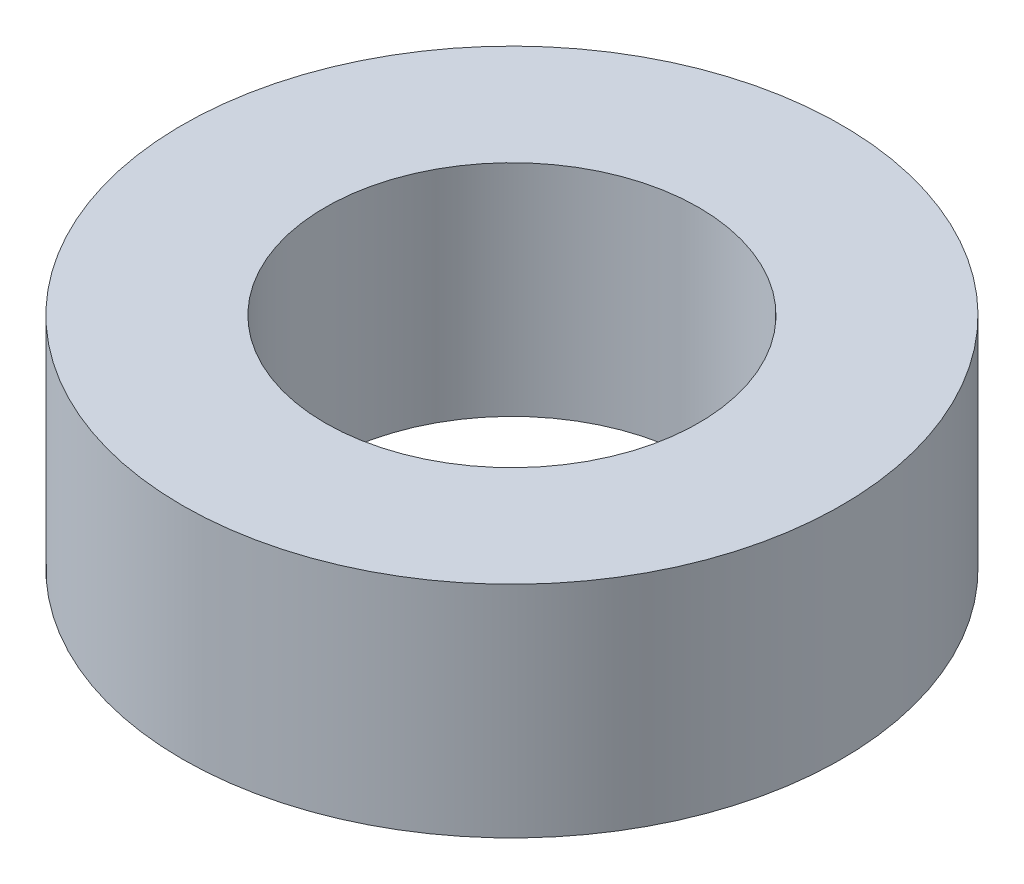
ISO-10303-21;
HEADER;
FILE_DESCRIPTION(('STEP AP214'),'2;1');
FILE_NAME('part.step','',(''),(''),'','','');
FILE_SCHEMA(('AUTOMOTIVE_DESIGN { 1 0 10303 214 1 1 1 1 }'));
ENDSEC;
DATA;
#1=APPLICATION_CONTEXT('core data for automotive mechanical design processes');
#2=APPLICATION_PROTOCOL_DEFINITION('international standard','automotive_design',2000,#1);
#3=PRODUCT_CONTEXT('',#1,'mechanical');
#4=PRODUCT('Part','Part','',(#3));
#5=PRODUCT_RELATED_PRODUCT_CATEGORY('part','',(#4));
#6=PRODUCT_DEFINITION_FORMATION('','',#4);
#7=PRODUCT_DEFINITION_CONTEXT('part definition',#1,'design');
#8=PRODUCT_DEFINITION('design','',#6,#7);
#9=PRODUCT_DEFINITION_SHAPE('','',#8);
#10=(LENGTH_UNIT() NAMED_UNIT(*) SI_UNIT(.MILLI.,.METRE.));
#11=(NAMED_UNIT(*) PLANE_ANGLE_UNIT() SI_UNIT($,.RADIAN.));
#12=(NAMED_UNIT(*) SI_UNIT($,.STERADIAN.) SOLID_ANGLE_UNIT());
#13=UNCERTAINTY_MEASURE_WITH_UNIT(LENGTH_MEASURE(1.E-05),#10,'distance_accuracy_value','');
#14=(GEOMETRIC_REPRESENTATION_CONTEXT(3) GLOBAL_UNCERTAINTY_ASSIGNED_CONTEXT((#13)) GLOBAL_UNIT_ASSIGNED_CONTEXT((#10,
#11,#12)) REPRESENTATION_CONTEXT('',''));
#15=CARTESIAN_POINT('',(0.,0.,0.));
#16=DIRECTION('',(0.,0.,1.));
#17=DIRECTION('',(1.,0.,0.));
#18=AXIS2_PLACEMENT_3D('',#15,#16,#17);
#19=CARTESIAN_POINT('',(0.,2.,0.));
#20=DIRECTION('',(0.,1.,0.));
#21=DIRECTION('',(0.,0.,1.));
#22=AXIS2_PLACEMENT_3D('',#19,#20,#21);
#23=PLANE('',#22);
#24=CARTESIAN_POINT('',(0.,2.,0.));
#25=DIRECTION('',(0.,1.,0.));
#26=DIRECTION('',(0.,0.,1.));
#27=AXIS2_PLACEMENT_3D('',#24,#25,#26);
#28=CIRCLE('',#27,3.);
#29=CARTESIAN_POINT('',(0.,2.,3.));
#30=VERTEX_POINT('',#29);
#31=EDGE_CURVE('E10',#30,#30,#28,.T.);
#32=ORIENTED_EDGE('',*,*,#31,.T.);
#33=EDGE_LOOP('',(#32));
#34=FACE_BOUND('',#33,.T.);
#35=CARTESIAN_POINT('',(0.,2.,0.));
#36=DIRECTION('',(0.,1.,0.));
#37=DIRECTION('',(0.,0.,1.));
#38=AXIS2_PLACEMENT_3D('',#35,#36,#37);
#39=CIRCLE('',#38,1.7);
#40=CARTESIAN_POINT('',(0.,2.,1.7));
#41=VERTEX_POINT('',#40);
#42=EDGE_CURVE('E43',#41,#41,#39,.T.);
#43=ORIENTED_EDGE('',*,*,#42,.F.);
#44=EDGE_LOOP('',(#43));
#45=FACE_BOUND('',#44,.T.);
#46=ADVANCED_FACE('F32',(#34,#45),#23,.T.);
#47=CARTESIAN_POINT('',(0.,0.,0.));
#48=DIRECTION('',(0.,1.,0.));
#49=DIRECTION('',(0.,0.,1.));
#50=AXIS2_PLACEMENT_3D('',#47,#48,#49);
#51=PLANE('',#50);
#52=CARTESIAN_POINT('',(0.,0.,0.));
#53=DIRECTION('',(0.,1.,0.));
#54=DIRECTION('',(0.,0.,1.));
#55=AXIS2_PLACEMENT_3D('',#52,#53,#54);
#56=CIRCLE('',#55,3.);
#57=CARTESIAN_POINT('',(0.,0.,3.));
#58=VERTEX_POINT('',#57);
#59=EDGE_CURVE('E36',#58,#58,#56,.T.);
#60=ORIENTED_EDGE('',*,*,#59,.F.);
#61=EDGE_LOOP('',(#60));
#62=FACE_BOUND('',#61,.T.);
#63=CARTESIAN_POINT('',(0.,0.,0.));
#64=DIRECTION('',(0.,1.,0.));
#65=DIRECTION('',(0.,0.,1.));
#66=AXIS2_PLACEMENT_3D('',#63,#64,#65);
#67=CIRCLE('',#66,1.7);
#68=CARTESIAN_POINT('',(0.,0.,1.7));
#69=VERTEX_POINT('',#68);
#70=EDGE_CURVE('E45',#69,#69,#67,.T.);
#71=ORIENTED_EDGE('',*,*,#70,.T.);
#72=EDGE_LOOP('',(#71));
#73=FACE_BOUND('',#72,.T.);
#74=ADVANCED_FACE('F55',(#62,#73),#51,.F.);
#75=CARTESIAN_POINT('',(0.,2.,0.));
#76=DIRECTION('',(0.,-1.,0.));
#77=DIRECTION('',(0.,0.,-1.));
#78=AXIS2_PLACEMENT_3D('',#75,#76,#77);
#79=CYLINDRICAL_SURFACE('',#78,3.);
#80=ORIENTED_EDGE('',*,*,#31,.F.);
#81=EDGE_LOOP('',(#80));
#82=FACE_BOUND('',#81,.T.);
#83=ORIENTED_EDGE('',*,*,#59,.T.);
#84=EDGE_LOOP('',(#83));
#85=FACE_BOUND('',#84,.T.);
#86=ADVANCED_FACE('F34',(#82,#85),#79,.T.);
#87=CARTESIAN_POINT('',(0.,2.,0.));
#88=DIRECTION('',(0.,-1.,0.));
#89=DIRECTION('',(0.,0.,-1.));
#90=AXIS2_PLACEMENT_3D('',#87,#88,#89);
#91=CYLINDRICAL_SURFACE('',#90,1.7);
#92=ORIENTED_EDGE('',*,*,#42,.T.);
#93=EDGE_LOOP('',(#92));
#94=FACE_BOUND('',#93,.T.);
#95=ORIENTED_EDGE('',*,*,#70,.F.);
#96=EDGE_LOOP('',(#95));
#97=FACE_BOUND('',#96,.T.);
#98=ADVANCED_FACE('F51',(#94,#97),#91,.F.);
#99=CLOSED_SHELL('',(#46,#74,#86,#98));
#100=MANIFOLD_SOLID_BREP('B2',#99);
#101=ADVANCED_BREP_SHAPE_REPRESENTATION('',(#18,#100),#14);
#102=SHAPE_DEFINITION_REPRESENTATION(#9,#101);
ENDSEC;
END-ISO-10303-21;
